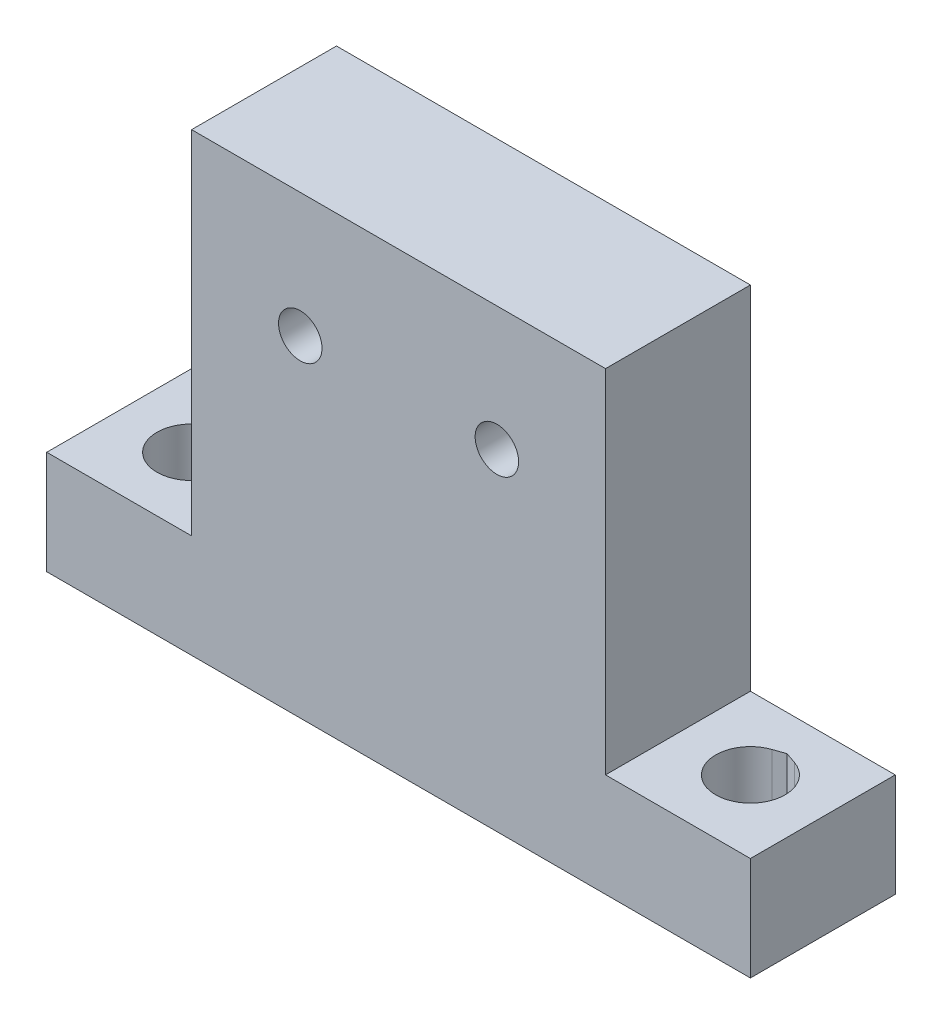
ISO-10303-21;
HEADER;
FILE_DESCRIPTION(('STEP AP214'),'2;1');
FILE_NAME('part.step','',(''),(''),'','','');
FILE_SCHEMA(('AUTOMOTIVE_DESIGN { 1 0 10303 214 1 1 1 1 }'));
ENDSEC;
DATA;
#1=APPLICATION_CONTEXT('core data for automotive mechanical design processes');
#2=APPLICATION_PROTOCOL_DEFINITION('international standard','automotive_design',2000,#1);
#3=PRODUCT_CONTEXT('',#1,'mechanical');
#4=PRODUCT('Part','Part','',(#3));
#5=PRODUCT_RELATED_PRODUCT_CATEGORY('part','',(#4));
#6=PRODUCT_DEFINITION_FORMATION('','',#4);
#7=PRODUCT_DEFINITION_CONTEXT('part definition',#1,'design');
#8=PRODUCT_DEFINITION('design','',#6,#7);
#9=PRODUCT_DEFINITION_SHAPE('','',#8);
#10=(LENGTH_UNIT() NAMED_UNIT(*) SI_UNIT(.MILLI.,.METRE.));
#11=(NAMED_UNIT(*) PLANE_ANGLE_UNIT() SI_UNIT($,.RADIAN.));
#12=(NAMED_UNIT(*) SI_UNIT($,.STERADIAN.) SOLID_ANGLE_UNIT());
#13=UNCERTAINTY_MEASURE_WITH_UNIT(LENGTH_MEASURE(1.E-05),#10,'distance_accuracy_value','');
#14=(GEOMETRIC_REPRESENTATION_CONTEXT(3) GLOBAL_UNCERTAINTY_ASSIGNED_CONTEXT((#13)) GLOBAL_UNIT_ASSIGNED_CONTEXT((#10,
#11,#12)) REPRESENTATION_CONTEXT('',''));
#15=CARTESIAN_POINT('',(0.,0.,0.));
#16=DIRECTION('',(0.,0.,1.));
#17=DIRECTION('',(1.,0.,0.));
#18=AXIS2_PLACEMENT_3D('',#15,#16,#17);
#19=CARTESIAN_POINT('',(0.,0.,7.));
#20=DIRECTION('',(0.,0.,-1.));
#21=DIRECTION('',(-1.,0.,0.));
#22=AXIS2_PLACEMENT_3D('',#19,#20,#21);
#23=PLANE('',#22);
#24=DIRECTION('',(0.,-1.,0.));
#25=VECTOR('',#24,1.);
#26=CARTESIAN_POINT('',(-10.,5.,7.));
#27=LINE('',#26,#25);
#28=CARTESIAN_POINT('',(-10.,22.,7.));
#29=VERTEX_POINT('',#28);
#30=CARTESIAN_POINT('',(-10.,5.,7.));
#31=VERTEX_POINT('',#30);
#32=EDGE_CURVE('E233',#29,#31,#27,.T.);
#33=ORIENTED_EDGE('',*,*,#32,.T.);
#34=DIRECTION('',(-1.,0.,0.));
#35=VECTOR('',#34,1.);
#36=CARTESIAN_POINT('',(-10.,5.,7.));
#37=LINE('',#36,#35);
#38=CARTESIAN_POINT('',(-17.,5.,7.));
#39=VERTEX_POINT('',#38);
#40=EDGE_CURVE('E237',#31,#39,#37,.T.);
#41=ORIENTED_EDGE('',*,*,#40,.T.);
#42=DIRECTION('',(0.,-1.,0.));
#43=VECTOR('',#42,1.);
#44=CARTESIAN_POINT('',(-17.,5.,7.));
#45=LINE('',#44,#43);
#46=CARTESIAN_POINT('',(-17.,0.,7.));
#47=VERTEX_POINT('',#46);
#48=EDGE_CURVE('E241',#39,#47,#45,.T.);
#49=ORIENTED_EDGE('',*,*,#48,.T.);
#50=DIRECTION('',(1.,0.,0.));
#51=VECTOR('',#50,1.);
#52=CARTESIAN_POINT('',(-17.,0.,7.));
#53=LINE('',#52,#51);
#54=CARTESIAN_POINT('',(17.,0.,7.));
#55=VERTEX_POINT('',#54);
#56=EDGE_CURVE('E244',#47,#55,#53,.T.);
#57=ORIENTED_EDGE('',*,*,#56,.T.);
#58=DIRECTION('',(0.,1.,0.));
#59=VECTOR('',#58,1.);
#60=CARTESIAN_POINT('',(17.,5.,7.));
#61=LINE('',#60,#59);
#62=CARTESIAN_POINT('',(17.,5.,7.));
#63=VERTEX_POINT('',#62);
#64=EDGE_CURVE('E247',#55,#63,#61,.T.);
#65=ORIENTED_EDGE('',*,*,#64,.T.);
#66=DIRECTION('',(-1.,0.,0.));
#67=VECTOR('',#66,1.);
#68=CARTESIAN_POINT('',(10.,5.,7.));
#69=LINE('',#68,#67);
#70=CARTESIAN_POINT('',(10.,5.,7.));
#71=VERTEX_POINT('',#70);
#72=EDGE_CURVE('E250',#63,#71,#69,.T.);
#73=ORIENTED_EDGE('',*,*,#72,.T.);
#74=DIRECTION('',(0.,1.,0.));
#75=VECTOR('',#74,1.);
#76=CARTESIAN_POINT('',(10.,5.,7.));
#77=LINE('',#76,#75);
#78=CARTESIAN_POINT('',(10.,22.,7.));
#79=VERTEX_POINT('',#78);
#80=EDGE_CURVE('E253',#71,#79,#77,.T.);
#81=ORIENTED_EDGE('',*,*,#80,.T.);
#82=DIRECTION('',(-1.,0.,0.));
#83=VECTOR('',#82,1.);
#84=CARTESIAN_POINT('',(-10.,22.,7.));
#85=LINE('',#84,#83);
#86=EDGE_CURVE('E256',#79,#29,#85,.T.);
#87=ORIENTED_EDGE('',*,*,#86,.T.);
#88=EDGE_LOOP('',(#33,#41,#49,#57,#65,#73,#81,#87));
#89=FACE_BOUND('',#88,.T.);
#90=CARTESIAN_POINT('',(-4.75,16.,7.));
#91=DIRECTION('',(0.,0.,1.));
#92=DIRECTION('',(1.,0.,0.));
#93=AXIS2_PLACEMENT_3D('',#90,#91,#92);
#94=CIRCLE('',#93,1.05);
#95=CARTESIAN_POINT('',(-3.7,16.,7.));
#96=VERTEX_POINT('',#95);
#97=EDGE_CURVE('E225',#96,#96,#94,.T.);
#98=ORIENTED_EDGE('',*,*,#97,.F.);
#99=EDGE_LOOP('',(#98));
#100=FACE_BOUND('',#99,.T.);
#101=CARTESIAN_POINT('',(4.75,16.,7.));
#102=DIRECTION('',(0.,0.,1.));
#103=DIRECTION('',(-1.,0.,0.));
#104=AXIS2_PLACEMENT_3D('',#101,#102,#103);
#105=CIRCLE('',#104,1.05);
#106=CARTESIAN_POINT('',(3.7,16.,7.));
#107=VERTEX_POINT('',#106);
#108=EDGE_CURVE('E217',#107,#107,#105,.T.);
#109=ORIENTED_EDGE('',*,*,#108,.F.);
#110=EDGE_LOOP('',(#109));
#111=FACE_BOUND('',#110,.T.);
#112=ADVANCED_FACE('F45',(#89,#100,#111),#23,.F.);
#113=CARTESIAN_POINT('',(0.,0.,0.));
#114=DIRECTION('',(0.,0.,-1.));
#115=DIRECTION('',(-1.,0.,0.));
#116=AXIS2_PLACEMENT_3D('',#113,#114,#115);
#117=PLANE('',#116);
#118=CARTESIAN_POINT('',(-4.75,16.,0.));
#119=DIRECTION('',(0.,0.,1.));
#120=DIRECTION('',(1.,0.,0.));
#121=AXIS2_PLACEMENT_3D('',#118,#119,#120);
#122=CIRCLE('',#121,1.05);
#123=CARTESIAN_POINT('',(-3.7,16.,0.));
#124=VERTEX_POINT('',#123);
#125=EDGE_CURVE('E221',#124,#124,#122,.T.);
#126=ORIENTED_EDGE('',*,*,#125,.T.);
#127=EDGE_LOOP('',(#126));
#128=FACE_BOUND('',#127,.T.);
#129=DIRECTION('',(0.,-1.,0.));
#130=VECTOR('',#129,1.);
#131=CARTESIAN_POINT('',(-10.,5.,0.));
#132=LINE('',#131,#130);
#133=CARTESIAN_POINT('',(-10.,22.,0.));
#134=VERTEX_POINT('',#133);
#135=CARTESIAN_POINT('',(-10.,5.,0.));
#136=VERTEX_POINT('',#135);
#137=EDGE_CURVE('E229',#134,#136,#132,.T.);
#138=ORIENTED_EDGE('',*,*,#137,.F.);
#139=DIRECTION('',(-1.,0.,0.));
#140=VECTOR('',#139,1.);
#141=CARTESIAN_POINT('',(-10.,22.,0.));
#142=LINE('',#141,#140);
#143=CARTESIAN_POINT('',(10.,22.,0.));
#144=VERTEX_POINT('',#143);
#145=EDGE_CURVE('E238',#144,#134,#142,.T.);
#146=ORIENTED_EDGE('',*,*,#145,.F.);
#147=DIRECTION('',(0.,1.,0.));
#148=VECTOR('',#147,1.);
#149=CARTESIAN_POINT('',(10.,5.,0.));
#150=LINE('',#149,#148);
#151=CARTESIAN_POINT('',(10.,5.,0.));
#152=VERTEX_POINT('',#151);
#153=EDGE_CURVE('E278',#152,#144,#150,.T.);
#154=ORIENTED_EDGE('',*,*,#153,.F.);
#155=DIRECTION('',(-1.,0.,0.));
#156=VECTOR('',#155,1.);
#157=CARTESIAN_POINT('',(10.,5.,0.));
#158=LINE('',#157,#156);
#159=CARTESIAN_POINT('',(17.,5.,0.));
#160=VERTEX_POINT('',#159);
#161=EDGE_CURVE('E275',#160,#152,#158,.T.);
#162=ORIENTED_EDGE('',*,*,#161,.F.);
#163=DIRECTION('',(0.,1.,0.));
#164=VECTOR('',#163,1.);
#165=CARTESIAN_POINT('',(17.,5.,0.));
#166=LINE('',#165,#164);
#167=CARTESIAN_POINT('',(17.,0.,0.));
#168=VERTEX_POINT('',#167);
#169=EDGE_CURVE('E272',#168,#160,#166,.T.);
#170=ORIENTED_EDGE('',*,*,#169,.F.);
#171=DIRECTION('',(1.,0.,0.));
#172=VECTOR('',#171,1.);
#173=CARTESIAN_POINT('',(-17.,0.,0.));
#174=LINE('',#173,#172);
#175=CARTESIAN_POINT('',(-17.,0.,0.));
#176=VERTEX_POINT('',#175);
#177=EDGE_CURVE('E269',#176,#168,#174,.T.);
#178=ORIENTED_EDGE('',*,*,#177,.F.);
#179=DIRECTION('',(0.,-1.,0.));
#180=VECTOR('',#179,1.);
#181=CARTESIAN_POINT('',(-17.,5.,0.));
#182=LINE('',#181,#180);
#183=CARTESIAN_POINT('',(-17.,5.,0.));
#184=VERTEX_POINT('',#183);
#185=EDGE_CURVE('E266',#184,#176,#182,.T.);
#186=ORIENTED_EDGE('',*,*,#185,.F.);
#187=DIRECTION('',(-1.,0.,0.));
#188=VECTOR('',#187,1.);
#189=CARTESIAN_POINT('',(-10.,5.,0.));
#190=LINE('',#189,#188);
#191=EDGE_CURVE('E263',#136,#184,#190,.T.);
#192=ORIENTED_EDGE('',*,*,#191,.F.);
#193=EDGE_LOOP('',(#138,#146,#154,#162,#170,#178,#186,#192));
#194=FACE_BOUND('',#193,.T.);
#195=CARTESIAN_POINT('',(4.75,16.,0.));
#196=DIRECTION('',(0.,0.,1.));
#197=DIRECTION('',(-1.,0.,0.));
#198=AXIS2_PLACEMENT_3D('',#195,#196,#197);
#199=CIRCLE('',#198,1.05);
#200=CARTESIAN_POINT('',(3.7,16.,0.));
#201=VERTEX_POINT('',#200);
#202=EDGE_CURVE('E182',#201,#201,#199,.T.);
#203=ORIENTED_EDGE('',*,*,#202,.T.);
#204=EDGE_LOOP('',(#203));
#205=FACE_BOUND('',#204,.T.);
#206=ADVANCED_FACE('F317',(#128,#194,#205),#117,.T.);
#207=CARTESIAN_POINT('',(-10.,5.,7.));
#208=DIRECTION('',(1.,0.,0.));
#209=DIRECTION('',(0.,1.,0.));
#210=AXIS2_PLACEMENT_3D('',#207,#208,#209);
#211=PLANE('',#210);
#212=ORIENTED_EDGE('',*,*,#137,.T.);
#213=DIRECTION('',(0.,0.,-1.));
#214=VECTOR('',#213,1.);
#215=CARTESIAN_POINT('',(-10.,5.,7.));
#216=LINE('',#215,#214);
#217=EDGE_CURVE('E11',#31,#136,#216,.T.);
#218=ORIENTED_EDGE('',*,*,#217,.F.);
#219=ORIENTED_EDGE('',*,*,#32,.F.);
#220=DIRECTION('',(0.,0.,-1.));
#221=VECTOR('',#220,1.);
#222=CARTESIAN_POINT('',(-10.,22.,7.));
#223=LINE('',#222,#221);
#224=EDGE_CURVE('E259',#29,#134,#223,.T.);
#225=ORIENTED_EDGE('',*,*,#224,.T.);
#226=EDGE_LOOP('',(#212,#218,#219,#225));
#227=FACE_BOUND('',#226,.T.);
#228=ADVANCED_FACE('F47',(#227),#211,.F.);
#229=CARTESIAN_POINT('',(-10.,5.,7.));
#230=DIRECTION('',(0.,-1.,0.));
#231=DIRECTION('',(1.,0.,0.));
#232=AXIS2_PLACEMENT_3D('',#229,#230,#231);
#233=PLANE('',#232);
#234=DIRECTION('',(-0.944553273569955,0.,-0.328358208955223));
#235=VECTOR('',#234,1.);
#236=CARTESIAN_POINT('',(-13.5,5.,1.72667492997053));
#237=LINE('',#236,#235);
#238=CARTESIAN_POINT('',(-12.95,5.,1.91787326677032));
#239=VERTEX_POINT('',#238);
#240=CARTESIAN_POINT('',(-13.5,5.,1.72667492997053));
#241=VERTEX_POINT('',#240);
#242=EDGE_CURVE('E169',#239,#241,#237,.T.);
#243=ORIENTED_EDGE('',*,*,#242,.F.);
#244=CARTESIAN_POINT('',(-13.5,5.,3.5));
#245=DIRECTION('',(0.,1.,0.));
#246=DIRECTION('',(-1.,0.,0.));
#247=AXIS2_PLACEMENT_3D('',#244,#245,#246);
#248=CIRCLE('',#247,1.675);
#249=CARTESIAN_POINT('',(-14.05,5.,1.91787326677032));
#250=VERTEX_POINT('',#249);
#251=EDGE_CURVE('E61',#250,#239,#248,.T.);
#252=ORIENTED_EDGE('',*,*,#251,.F.);
#253=DIRECTION('',(-0.944553273569955,0.,0.328358208955223));
#254=VECTOR('',#253,1.);
#255=CARTESIAN_POINT('',(-13.5,5.,1.72667492997053));
#256=LINE('',#255,#254);
#257=EDGE_CURVE('E165',#241,#250,#256,.T.);
#258=ORIENTED_EDGE('',*,*,#257,.F.);
#259=EDGE_LOOP('',(#243,#252,#258));
#260=FACE_BOUND('',#259,.T.);
#261=ORIENTED_EDGE('',*,*,#191,.T.);
#262=DIRECTION('',(0.,0.,-1.));
#263=VECTOR('',#262,1.);
#264=CARTESIAN_POINT('',(-17.,5.,7.));
#265=LINE('',#264,#263);
#266=EDGE_CURVE('E54',#39,#184,#265,.T.);
#267=ORIENTED_EDGE('',*,*,#266,.F.);
#268=ORIENTED_EDGE('',*,*,#40,.F.);
#269=ORIENTED_EDGE('',*,*,#217,.T.);
#270=EDGE_LOOP('',(#261,#267,#268,#269));
#271=FACE_BOUND('',#270,.T.);
#272=ADVANCED_FACE('F334',(#260,#271),#233,.F.);
#273=CARTESIAN_POINT('',(-17.,5.,7.));
#274=DIRECTION('',(1.,0.,0.));
#275=DIRECTION('',(0.,0.,-1.));
#276=AXIS2_PLACEMENT_3D('',#273,#274,#275);
#277=PLANE('',#276);
#278=ORIENTED_EDGE('',*,*,#185,.T.);
#279=DIRECTION('',(0.,0.,-1.));
#280=VECTOR('',#279,1.);
#281=CARTESIAN_POINT('',(-17.,0.,7.));
#282=LINE('',#281,#280);
#283=EDGE_CURVE('E302',#47,#176,#282,.T.);
#284=ORIENTED_EDGE('',*,*,#283,.F.);
#285=ORIENTED_EDGE('',*,*,#48,.F.);
#286=ORIENTED_EDGE('',*,*,#266,.T.);
#287=EDGE_LOOP('',(#278,#284,#285,#286));
#288=FACE_BOUND('',#287,.T.);
#289=ADVANCED_FACE('F311',(#288),#277,.F.);
#290=CARTESIAN_POINT('',(-17.,0.,7.));
#291=DIRECTION('',(0.,1.,0.));
#292=DIRECTION('',(-1.,0.,0.));
#293=AXIS2_PLACEMENT_3D('',#290,#291,#292);
#294=PLANE('',#293);
#295=DIRECTION('',(-0.944553273569955,0.,0.328358208955223));
#296=VECTOR('',#295,1.);
#297=CARTESIAN_POINT('',(-13.5,0.,1.72667492997053));
#298=LINE('',#297,#296);
#299=CARTESIAN_POINT('',(-13.5,0.,1.72667492997053));
#300=VERTEX_POINT('',#299);
#301=CARTESIAN_POINT('',(-14.05,0.,1.91787326677032));
#302=VERTEX_POINT('',#301);
#303=EDGE_CURVE('E69',#300,#302,#298,.T.);
#304=ORIENTED_EDGE('',*,*,#303,.T.);
#305=CARTESIAN_POINT('',(-13.5,0.,3.5));
#306=DIRECTION('',(0.,1.,0.));
#307=DIRECTION('',(-1.,0.,0.));
#308=AXIS2_PLACEMENT_3D('',#305,#306,#307);
#309=CIRCLE('',#308,1.675);
#310=CARTESIAN_POINT('',(-12.95,0.,1.91787326677032));
#311=VERTEX_POINT('',#310);
#312=EDGE_CURVE('E149',#302,#311,#309,.T.);
#313=ORIENTED_EDGE('',*,*,#312,.T.);
#314=DIRECTION('',(-0.944553273569955,0.,-0.328358208955223));
#315=VECTOR('',#314,1.);
#316=CARTESIAN_POINT('',(-13.5,0.,1.72667492997053));
#317=LINE('',#316,#315);
#318=EDGE_CURVE('E157',#311,#300,#317,.T.);
#319=ORIENTED_EDGE('',*,*,#318,.T.);
#320=EDGE_LOOP('',(#304,#313,#319));
#321=FACE_BOUND('',#320,.T.);
#322=DIRECTION('',(-0.944553273569955,0.,-0.328358208955223));
#323=VECTOR('',#322,1.);
#324=CARTESIAN_POINT('',(13.5,0.,1.72667492997053));
#325=LINE('',#324,#323);
#326=CARTESIAN_POINT('',(14.05,0.,1.91787326677032));
#327=VERTEX_POINT('',#326);
#328=CARTESIAN_POINT('',(13.5,0.,1.72667492997053));
#329=VERTEX_POINT('',#328);
#330=EDGE_CURVE('E189',#327,#329,#325,.T.);
#331=ORIENTED_EDGE('',*,*,#330,.T.);
#332=DIRECTION('',(-0.944553273569955,0.,0.328358208955223));
#333=VECTOR('',#332,1.);
#334=CARTESIAN_POINT('',(13.5,0.,1.72667492997053));
#335=LINE('',#334,#333);
#336=CARTESIAN_POINT('',(12.95,0.,1.91787326677032));
#337=VERTEX_POINT('',#336);
#338=EDGE_CURVE('E201',#329,#337,#335,.T.);
#339=ORIENTED_EDGE('',*,*,#338,.T.);
#340=CARTESIAN_POINT('',(13.5,0.,3.49999999999999));
#341=DIRECTION('',(0.,1.,0.));
#342=DIRECTION('',(1.,0.,0.));
#343=AXIS2_PLACEMENT_3D('',#340,#341,#342);
#344=CIRCLE('',#343,1.675);
#345=EDGE_CURVE('E210',#337,#327,#344,.T.);
#346=ORIENTED_EDGE('',*,*,#345,.T.);
#347=EDGE_LOOP('',(#331,#339,#346));
#348=FACE_BOUND('',#347,.T.);
#349=ORIENTED_EDGE('',*,*,#177,.T.);
#350=DIRECTION('',(0.,0.,-1.));
#351=VECTOR('',#350,1.);
#352=CARTESIAN_POINT('',(17.,0.,7.));
#353=LINE('',#352,#351);
#354=EDGE_CURVE('E298',#55,#168,#353,.T.);
#355=ORIENTED_EDGE('',*,*,#354,.F.);
#356=ORIENTED_EDGE('',*,*,#56,.F.);
#357=ORIENTED_EDGE('',*,*,#283,.T.);
#358=EDGE_LOOP('',(#349,#355,#356,#357));
#359=FACE_BOUND('',#358,.T.);
#360=ADVANCED_FACE('F162',(#321,#348,#359),#294,.F.);
#361=CARTESIAN_POINT('',(17.,5.,7.));
#362=DIRECTION('',(-1.,0.,0.));
#363=DIRECTION('',(0.,0.,1.));
#364=AXIS2_PLACEMENT_3D('',#361,#362,#363);
#365=PLANE('',#364);
#366=ORIENTED_EDGE('',*,*,#169,.T.);
#367=DIRECTION('',(0.,0.,-1.));
#368=VECTOR('',#367,1.);
#369=CARTESIAN_POINT('',(17.,5.,7.));
#370=LINE('',#369,#368);
#371=EDGE_CURVE('E294',#63,#160,#370,.T.);
#372=ORIENTED_EDGE('',*,*,#371,.F.);
#373=ORIENTED_EDGE('',*,*,#64,.F.);
#374=ORIENTED_EDGE('',*,*,#354,.T.);
#375=EDGE_LOOP('',(#366,#372,#373,#374));
#376=FACE_BOUND('',#375,.T.);
#377=ADVANCED_FACE('F326',(#376),#365,.F.);
#378=CARTESIAN_POINT('',(10.,5.,7.));
#379=DIRECTION('',(0.,-1.,0.));
#380=DIRECTION('',(1.,0.,0.));
#381=AXIS2_PLACEMENT_3D('',#378,#379,#380);
#382=PLANE('',#381);
#383=CARTESIAN_POINT('',(13.5,5.00000000000001,3.49999999999999));
#384=DIRECTION('',(0.,1.,0.));
#385=DIRECTION('',(1.,0.,0.));
#386=AXIS2_PLACEMENT_3D('',#383,#384,#385);
#387=CIRCLE('',#386,1.675);
#388=CARTESIAN_POINT('',(12.95,5.,1.91787326677032));
#389=VERTEX_POINT('',#388);
#390=CARTESIAN_POINT('',(14.05,5.00000000000001,1.91787326677032));
#391=VERTEX_POINT('',#390);
#392=EDGE_CURVE('E200',#389,#391,#387,.T.);
#393=ORIENTED_EDGE('',*,*,#392,.F.);
#394=DIRECTION('',(-0.944553273569955,0.,0.328358208955223));
#395=VECTOR('',#394,1.);
#396=CARTESIAN_POINT('',(13.5,5.00000000000001,1.72667492997053));
#397=LINE('',#396,#395);
#398=CARTESIAN_POINT('',(13.5,5.00000000000001,1.72667492997053));
#399=VERTEX_POINT('',#398);
#400=EDGE_CURVE('E176',#399,#389,#397,.T.);
#401=ORIENTED_EDGE('',*,*,#400,.F.);
#402=DIRECTION('',(-0.944553273569955,0.,-0.328358208955223));
#403=VECTOR('',#402,1.);
#404=CARTESIAN_POINT('',(13.5,5.00000000000001,1.72667492997053));
#405=LINE('',#404,#403);
#406=EDGE_CURVE('E196',#391,#399,#405,.T.);
#407=ORIENTED_EDGE('',*,*,#406,.F.);
#408=EDGE_LOOP('',(#393,#401,#407));
#409=FACE_BOUND('',#408,.T.);
#410=ORIENTED_EDGE('',*,*,#161,.T.);
#411=DIRECTION('',(0.,0.,-1.));
#412=VECTOR('',#411,1.);
#413=CARTESIAN_POINT('',(10.,5.,7.));
#414=LINE('',#413,#412);
#415=EDGE_CURVE('E290',#71,#152,#414,.T.);
#416=ORIENTED_EDGE('',*,*,#415,.F.);
#417=ORIENTED_EDGE('',*,*,#72,.F.);
#418=ORIENTED_EDGE('',*,*,#371,.T.);
#419=EDGE_LOOP('',(#410,#416,#417,#418));
#420=FACE_BOUND('',#419,.T.);
#421=ADVANCED_FACE('F347',(#409,#420),#382,.F.);
#422=CARTESIAN_POINT('',(10.,5.,7.));
#423=DIRECTION('',(-1.,0.,0.));
#424=DIRECTION('',(0.,-1.,0.));
#425=AXIS2_PLACEMENT_3D('',#422,#423,#424);
#426=PLANE('',#425);
#427=ORIENTED_EDGE('',*,*,#153,.T.);
#428=DIRECTION('',(0.,0.,-1.));
#429=VECTOR('',#428,1.);
#430=CARTESIAN_POINT('',(10.,22.,7.));
#431=LINE('',#430,#429);
#432=EDGE_CURVE('E286',#79,#144,#431,.T.);
#433=ORIENTED_EDGE('',*,*,#432,.F.);
#434=ORIENTED_EDGE('',*,*,#80,.F.);
#435=ORIENTED_EDGE('',*,*,#415,.T.);
#436=EDGE_LOOP('',(#427,#433,#434,#435));
#437=FACE_BOUND('',#436,.T.);
#438=ADVANCED_FACE('F345',(#437),#426,.F.);
#439=CARTESIAN_POINT('',(-10.,22.,7.));
#440=DIRECTION('',(0.,-1.,0.));
#441=DIRECTION('',(0.,0.,-1.));
#442=AXIS2_PLACEMENT_3D('',#439,#440,#441);
#443=PLANE('',#442);
#444=ORIENTED_EDGE('',*,*,#145,.T.);
#445=ORIENTED_EDGE('',*,*,#224,.F.);
#446=ORIENTED_EDGE('',*,*,#86,.F.);
#447=ORIENTED_EDGE('',*,*,#432,.T.);
#448=EDGE_LOOP('',(#444,#445,#446,#447));
#449=FACE_BOUND('',#448,.T.);
#450=ADVANCED_FACE('F340',(#449),#443,.F.);
#451=CARTESIAN_POINT('',(-4.75,16.,7.));
#452=DIRECTION('',(0.,0.,-1.));
#453=DIRECTION('',(-1.,0.,0.));
#454=AXIS2_PLACEMENT_3D('',#451,#452,#453);
#455=CYLINDRICAL_SURFACE('',#454,1.05);
#456=ORIENTED_EDGE('',*,*,#97,.T.);
#457=EDGE_LOOP('',(#456));
#458=FACE_BOUND('',#457,.T.);
#459=ORIENTED_EDGE('',*,*,#125,.F.);
#460=EDGE_LOOP('',(#459));
#461=FACE_BOUND('',#460,.T.);
#462=ADVANCED_FACE('F368',(#458,#461),#455,.F.);
#463=CARTESIAN_POINT('',(4.75,16.,7.));
#464=DIRECTION('',(0.,0.,-1.));
#465=DIRECTION('',(-1.,0.,0.));
#466=AXIS2_PLACEMENT_3D('',#463,#464,#465);
#467=CYLINDRICAL_SURFACE('',#466,1.05);
#468=ORIENTED_EDGE('',*,*,#108,.T.);
#469=EDGE_LOOP('',(#468));
#470=FACE_BOUND('',#469,.T.);
#471=ORIENTED_EDGE('',*,*,#202,.F.);
#472=EDGE_LOOP('',(#471));
#473=FACE_BOUND('',#472,.T.);
#474=ADVANCED_FACE('F375',(#470,#473),#467,.F.);
#475=CARTESIAN_POINT('',(13.5,0.,1.72667492997053));
#476=DIRECTION('',(-0.328358208955223,0.,-0.944553273569955));
#477=DIRECTION('',(-0.944553273569955,0.,0.328358208955223));
#478=AXIS2_PLACEMENT_3D('',#475,#476,#477);
#479=PLANE('',#478);
#480=ORIENTED_EDGE('',*,*,#400,.T.);
#481=DIRECTION('',(0.,1.,0.));
#482=VECTOR('',#481,1.);
#483=CARTESIAN_POINT('',(12.95,0.,1.91787326677032));
#484=LINE('',#483,#482);
#485=EDGE_CURVE('E185',#337,#389,#484,.T.);
#486=ORIENTED_EDGE('',*,*,#485,.F.);
#487=ORIENTED_EDGE('',*,*,#338,.F.);
#488=DIRECTION('',(0.,1.,0.));
#489=VECTOR('',#488,1.);
#490=CARTESIAN_POINT('',(13.5,0.,1.72667492997053));
#491=LINE('',#490,#489);
#492=EDGE_CURVE('E193',#329,#399,#491,.T.);
#493=ORIENTED_EDGE('',*,*,#492,.T.);
#494=EDGE_LOOP('',(#480,#486,#487,#493));
#495=FACE_BOUND('',#494,.T.);
#496=ADVANCED_FACE('F380',(#495),#479,.F.);
#497=CARTESIAN_POINT('',(13.5,0.,1.72667492997053));
#498=DIRECTION('',(0.328358208955223,0.,-0.944553273569955));
#499=DIRECTION('',(-0.944553273569955,0.,-0.328358208955223));
#500=AXIS2_PLACEMENT_3D('',#497,#498,#499);
#501=PLANE('',#500);
#502=ORIENTED_EDGE('',*,*,#406,.T.);
#503=ORIENTED_EDGE('',*,*,#492,.F.);
#504=ORIENTED_EDGE('',*,*,#330,.F.);
#505=DIRECTION('',(0.,1.,0.));
#506=VECTOR('',#505,1.);
#507=CARTESIAN_POINT('',(14.05,0.,1.91787326677032));
#508=LINE('',#507,#506);
#509=EDGE_CURVE('E190',#327,#391,#508,.T.);
#510=ORIENTED_EDGE('',*,*,#509,.T.);
#511=EDGE_LOOP('',(#502,#503,#504,#510));
#512=FACE_BOUND('',#511,.T.);
#513=ADVANCED_FACE('F392',(#512),#501,.F.);
#514=CARTESIAN_POINT('',(13.5,0.,3.49999999999999));
#515=DIRECTION('',(0.,1.,0.));
#516=DIRECTION('',(-1.,0.,0.));
#517=AXIS2_PLACEMENT_3D('',#514,#515,#516);
#518=CYLINDRICAL_SURFACE('',#517,1.675);
#519=ORIENTED_EDGE('',*,*,#392,.T.);
#520=ORIENTED_EDGE('',*,*,#509,.F.);
#521=ORIENTED_EDGE('',*,*,#345,.F.);
#522=ORIENTED_EDGE('',*,*,#485,.T.);
#523=EDGE_LOOP('',(#519,#520,#521,#522));
#524=FACE_BOUND('',#523,.T.);
#525=ADVANCED_FACE('F398',(#524),#518,.F.);
#526=CARTESIAN_POINT('',(-13.5,0.,3.5));
#527=DIRECTION('',(0.,1.,0.));
#528=DIRECTION('',(-1.,0.,0.));
#529=AXIS2_PLACEMENT_3D('',#526,#527,#528);
#530=CYLINDRICAL_SURFACE('',#529,1.675);
#531=ORIENTED_EDGE('',*,*,#251,.T.);
#532=DIRECTION('',(0.,1.,0.));
#533=VECTOR('',#532,1.);
#534=CARTESIAN_POINT('',(-12.95,0.,1.91787326677032));
#535=LINE('',#534,#533);
#536=EDGE_CURVE('E145',#311,#239,#535,.T.);
#537=ORIENTED_EDGE('',*,*,#536,.F.);
#538=ORIENTED_EDGE('',*,*,#312,.F.);
#539=DIRECTION('',(0.,1.,0.));
#540=VECTOR('',#539,1.);
#541=CARTESIAN_POINT('',(-14.05,0.,1.91787326677032));
#542=LINE('',#541,#540);
#543=EDGE_CURVE('E179',#302,#250,#542,.T.);
#544=ORIENTED_EDGE('',*,*,#543,.T.);
#545=EDGE_LOOP('',(#531,#537,#538,#544));
#546=FACE_BOUND('',#545,.T.);
#547=ADVANCED_FACE('F147',(#546),#530,.F.);
#548=CARTESIAN_POINT('',(-13.5,0.,1.72667492997053));
#549=DIRECTION('',(-0.328358208955223,0.,-0.944553273569955));
#550=DIRECTION('',(-0.944553273569955,0.,0.328358208955223));
#551=AXIS2_PLACEMENT_3D('',#548,#549,#550);
#552=PLANE('',#551);
#553=ORIENTED_EDGE('',*,*,#257,.T.);
#554=ORIENTED_EDGE('',*,*,#543,.F.);
#555=ORIENTED_EDGE('',*,*,#303,.F.);
#556=DIRECTION('',(0.,1.,0.));
#557=VECTOR('',#556,1.);
#558=CARTESIAN_POINT('',(-13.5,0.,1.72667492997053));
#559=LINE('',#558,#557);
#560=EDGE_CURVE('E154',#300,#241,#559,.T.);
#561=ORIENTED_EDGE('',*,*,#560,.T.);
#562=EDGE_LOOP('',(#553,#554,#555,#561));
#563=FACE_BOUND('',#562,.T.);
#564=ADVANCED_FACE('F405',(#563),#552,.F.);
#565=CARTESIAN_POINT('',(-13.5,0.,1.72667492997053));
#566=DIRECTION('',(0.328358208955223,0.,-0.944553273569955));
#567=DIRECTION('',(-0.944553273569955,0.,-0.328358208955223));
#568=AXIS2_PLACEMENT_3D('',#565,#566,#567);
#569=PLANE('',#568);
#570=ORIENTED_EDGE('',*,*,#242,.T.);
#571=ORIENTED_EDGE('',*,*,#560,.F.);
#572=ORIENTED_EDGE('',*,*,#318,.F.);
#573=ORIENTED_EDGE('',*,*,#536,.T.);
#574=EDGE_LOOP('',(#570,#571,#572,#573));
#575=FACE_BOUND('',#574,.T.);
#576=ADVANCED_FACE('F158',(#575),#569,.F.);
#577=CLOSED_SHELL('',(#112,#206,#228,#272,#289,#360,#377,#421,#438,#450,#462,#474,#496,#513,
#525,#547,#564,#576));
#578=MANIFOLD_SOLID_BREP('B2',#577);
#579=ADVANCED_BREP_SHAPE_REPRESENTATION('',(#18,#578),#14);
#580=SHAPE_DEFINITION_REPRESENTATION(#9,#579);
ENDSEC;
END-ISO-10303-21;
